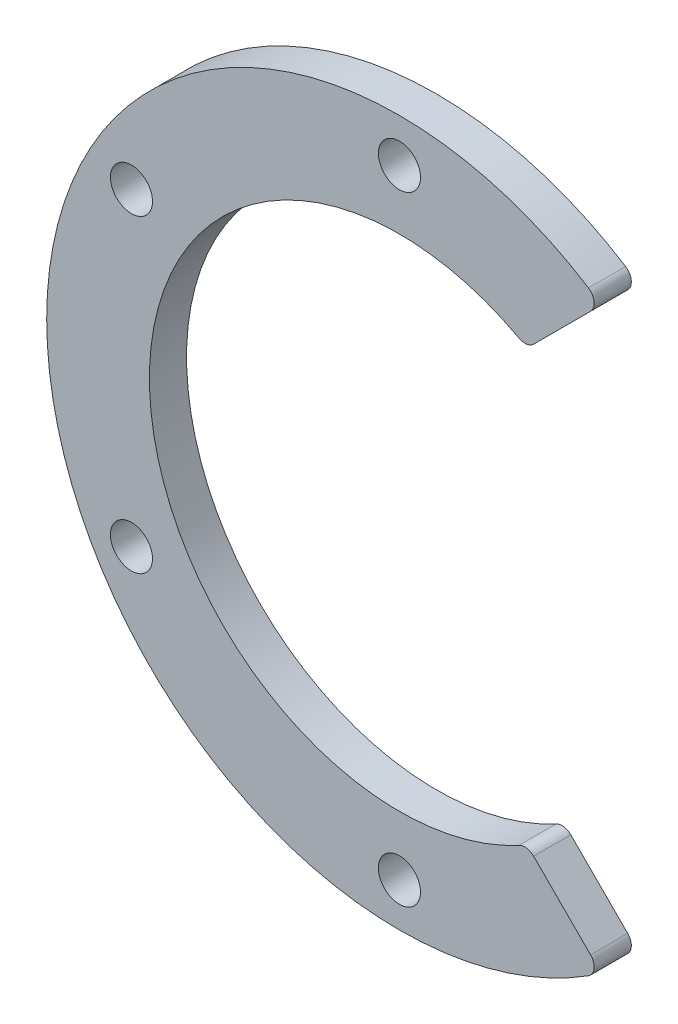
ISO-10303-21;
HEADER;
FILE_DESCRIPTION(('STEP AP214'),'2;1');
FILE_NAME('part.step','',(''),(''),'','','');
FILE_SCHEMA(('AUTOMOTIVE_DESIGN { 1 0 10303 214 1 1 1 1 }'));
ENDSEC;
DATA;
#1=APPLICATION_CONTEXT('core data for automotive mechanical design processes');
#2=APPLICATION_PROTOCOL_DEFINITION('international standard','automotive_design',2000,#1);
#3=PRODUCT_CONTEXT('',#1,'mechanical');
#4=PRODUCT('Part','Part','',(#3));
#5=PRODUCT_RELATED_PRODUCT_CATEGORY('part','',(#4));
#6=PRODUCT_DEFINITION_FORMATION('','',#4);
#7=PRODUCT_DEFINITION_CONTEXT('part definition',#1,'design');
#8=PRODUCT_DEFINITION('design','',#6,#7);
#9=PRODUCT_DEFINITION_SHAPE('','',#8);
#10=(LENGTH_UNIT() NAMED_UNIT(*) SI_UNIT(.MILLI.,.METRE.));
#11=(NAMED_UNIT(*) PLANE_ANGLE_UNIT() SI_UNIT($,.RADIAN.));
#12=(NAMED_UNIT(*) SI_UNIT($,.STERADIAN.) SOLID_ANGLE_UNIT());
#13=UNCERTAINTY_MEASURE_WITH_UNIT(LENGTH_MEASURE(1.E-05),#10,'distance_accuracy_value','');
#14=(GEOMETRIC_REPRESENTATION_CONTEXT(3) GLOBAL_UNCERTAINTY_ASSIGNED_CONTEXT((#13)) GLOBAL_UNIT_ASSIGNED_CONTEXT((#10,
#11,#12)) REPRESENTATION_CONTEXT('',''));
#15=CARTESIAN_POINT('',(0.,0.,0.));
#16=DIRECTION('',(0.,0.,1.));
#17=DIRECTION('',(1.,0.,0.));
#18=AXIS2_PLACEMENT_3D('',#15,#16,#17);
#19=CARTESIAN_POINT('',(14.734319027229,-23.2196004014676,3.));
#20=DIRECTION('',(0.,0.,-1.));
#21=DIRECTION('',(-1.,0.,0.));
#22=AXIS2_PLACEMENT_3D('',#19,#20,#21);
#23=CYLINDRICAL_SURFACE('',#22,1.00000000000001);
#24=CARTESIAN_POINT('',(14.734319027229,-23.2196004014676,0.));
#25=DIRECTION('',(0.,0.,-1.));
#26=DIRECTION('',(-1.,0.,0.));
#27=AXIS2_PLACEMENT_3D('',#24,#25,#26);
#28=CIRCLE('',#27,1.00000000000001);
#29=CARTESIAN_POINT('',(15.4414258084155,-22.5124936202811,0.));
#30=VERTEX_POINT('',#29);
#31=CARTESIAN_POINT('',(15.270112446401,-24.0639495069756,0.));
#32=VERTEX_POINT('',#31);
#33=EDGE_CURVE('E149',#30,#32,#28,.T.);
#34=ORIENTED_EDGE('',*,*,#33,.F.);
#35=DIRECTION('',(0.,0.,-1.));
#36=VECTOR('',#35,1.);
#37=CARTESIAN_POINT('',(15.4414258084155,-22.5124936202811,3.));
#38=LINE('',#37,#36);
#39=CARTESIAN_POINT('',(15.4414258084155,-22.5124936202811,3.));
#40=VERTEX_POINT('',#39);
#41=EDGE_CURVE('E11',#40,#30,#38,.T.);
#42=ORIENTED_EDGE('',*,*,#41,.F.);
#43=CARTESIAN_POINT('',(14.734319027229,-23.2196004014676,3.));
#44=DIRECTION('',(0.,0.,-1.));
#45=DIRECTION('',(-1.,0.,0.));
#46=AXIS2_PLACEMENT_3D('',#43,#44,#45);
#47=CIRCLE('',#46,1.00000000000001);
#48=CARTESIAN_POINT('',(15.270112446401,-24.0639495069756,3.));
#49=VERTEX_POINT('',#48);
#50=EDGE_CURVE('E178',#40,#49,#47,.T.);
#51=ORIENTED_EDGE('',*,*,#50,.T.);
#52=DIRECTION('',(0.,0.,-1.));
#53=VECTOR('',#52,1.);
#54=CARTESIAN_POINT('',(15.270112446401,-24.0639495069756,3.));
#55=LINE('',#54,#53);
#56=EDGE_CURVE('E48',#49,#32,#55,.T.);
#57=ORIENTED_EDGE('',*,*,#56,.T.);
#58=EDGE_LOOP('',(#34,#42,#51,#57));
#59=FACE_BOUND('',#58,.T.);
#60=ADVANCED_FACE('F45',(#59),#23,.T.);
#61=CARTESIAN_POINT('',(10.8422266985567,-17.9132945104223,3.));
#62=DIRECTION('',(0.707106781186549,0.707106781186546,0.));
#63=DIRECTION('',(-0.707106781186546,0.707106781186549,0.));
#64=AXIS2_PLACEMENT_3D('',#61,#62,#63);
#65=PLANE('',#64);
#66=DIRECTION('',(0.707106781186546,-0.707106781186549,0.));
#67=VECTOR('',#66,1.);
#68=CARTESIAN_POINT('',(10.8422266985567,-17.9132945104223,0.));
#69=LINE('',#68,#67);
#70=CARTESIAN_POINT('',(10.8422266985567,-17.9132945104222,0.));
#71=VERTEX_POINT('',#70);
#72=EDGE_CURVE('E175',#71,#30,#69,.T.);
#73=ORIENTED_EDGE('',*,*,#72,.F.);
#74=DIRECTION('',(0.,0.,-1.));
#75=VECTOR('',#74,1.);
#76=CARTESIAN_POINT('',(10.8422266985567,-17.9132945104222,3.));
#77=LINE('',#76,#75);
#78=CARTESIAN_POINT('',(10.8422266985567,-17.9132945104222,3.));
#79=VERTEX_POINT('',#78);
#80=EDGE_CURVE('E55',#79,#71,#77,.T.);
#81=ORIENTED_EDGE('',*,*,#80,.F.);
#82=DIRECTION('',(0.707106781186546,-0.707106781186549,0.));
#83=VECTOR('',#82,1.);
#84=CARTESIAN_POINT('',(10.8422266985567,-17.9132945104223,3.));
#85=LINE('',#84,#83);
#86=EDGE_CURVE('E134',#79,#40,#85,.T.);
#87=ORIENTED_EDGE('',*,*,#86,.T.);
#88=ORIENTED_EDGE('',*,*,#41,.T.);
#89=EDGE_LOOP('',(#73,#81,#87,#88));
#90=FACE_BOUND('',#89,.T.);
#91=ADVANCED_FACE('F196',(#90),#65,.T.);
#92=CARTESIAN_POINT('',(10.1351199173702,-18.6204012916088,3.));
#93=DIRECTION('',(0.,0.,-1.));
#94=DIRECTION('',(-1.,0.,0.));
#95=AXIS2_PLACEMENT_3D('',#92,#93,#94);
#96=CYLINDRICAL_SURFACE('',#95,0.999999999999997);
#97=CARTESIAN_POINT('',(10.1351199173702,-18.6204012916088,0.));
#98=DIRECTION('',(0.,0.,-1.));
#99=DIRECTION('',(-1.,0.,0.));
#100=AXIS2_PLACEMENT_3D('',#97,#98,#99);
#101=CIRCLE('',#100,0.999999999999997);
#102=CARTESIAN_POINT('',(9.65704822315463,-17.7420804759669,0.));
#103=VERTEX_POINT('',#102);
#104=EDGE_CURVE('E120',#103,#71,#101,.T.);
#105=ORIENTED_EDGE('',*,*,#104,.F.);
#106=DIRECTION('',(0.,0.,-1.));
#107=VECTOR('',#106,1.);
#108=CARTESIAN_POINT('',(9.65704822315463,-17.7420804759669,3.));
#109=LINE('',#108,#107);
#110=CARTESIAN_POINT('',(9.65704822315463,-17.7420804759669,3.));
#111=VERTEX_POINT('',#110);
#112=EDGE_CURVE('E115',#111,#103,#109,.T.);
#113=ORIENTED_EDGE('',*,*,#112,.F.);
#114=CARTESIAN_POINT('',(10.1351199173702,-18.6204012916088,3.));
#115=DIRECTION('',(0.,0.,-1.));
#116=DIRECTION('',(-1.,0.,0.));
#117=AXIS2_PLACEMENT_3D('',#114,#115,#116);
#118=CIRCLE('',#117,0.999999999999997);
#119=EDGE_CURVE('E118',#111,#79,#118,.T.);
#120=ORIENTED_EDGE('',*,*,#119,.T.);
#121=ORIENTED_EDGE('',*,*,#80,.T.);
#122=EDGE_LOOP('',(#105,#113,#120,#121));
#123=FACE_BOUND('',#122,.T.);
#124=ADVANCED_FACE('F117',(#123),#96,.T.);
#125=CARTESIAN_POINT('',(0.,0.,3.));
#126=DIRECTION('',(0.,0.,-1.));
#127=DIRECTION('',(-1.,0.,0.));
#128=AXIS2_PLACEMENT_3D('',#125,#126,#127);
#129=CYLINDRICAL_SURFACE('',#128,20.2000000000005);
#130=CARTESIAN_POINT('',(0.,0.,0.));
#131=DIRECTION('',(0.,0.,1.));
#132=DIRECTION('',(1.,0.,0.));
#133=AXIS2_PLACEMENT_3D('',#130,#131,#132);
#134=CIRCLE('',#133,20.2000000000005);
#135=CARTESIAN_POINT('',(9.65704822315463,17.7420804759669,0.));
#136=VERTEX_POINT('',#135);
#137=EDGE_CURVE('E170',#136,#103,#134,.T.);
#138=ORIENTED_EDGE('',*,*,#137,.F.);
#139=DIRECTION('',(0.,0.,-1.));
#140=VECTOR('',#139,1.);
#141=CARTESIAN_POINT('',(9.65704822315463,17.7420804759669,3.));
#142=LINE('',#141,#140);
#143=CARTESIAN_POINT('',(9.65704822315463,17.7420804759669,3.));
#144=VERTEX_POINT('',#143);
#145=EDGE_CURVE('E126',#144,#136,#142,.T.);
#146=ORIENTED_EDGE('',*,*,#145,.F.);
#147=CARTESIAN_POINT('',(0.,0.,3.));
#148=DIRECTION('',(0.,0.,1.));
#149=DIRECTION('',(1.,0.,0.));
#150=AXIS2_PLACEMENT_3D('',#147,#148,#149);
#151=CIRCLE('',#150,20.2000000000005);
#152=EDGE_CURVE('E132',#144,#111,#151,.T.);
#153=ORIENTED_EDGE('',*,*,#152,.T.);
#154=ORIENTED_EDGE('',*,*,#112,.T.);
#155=EDGE_LOOP('',(#138,#146,#153,#154));
#156=FACE_BOUND('',#155,.T.);
#157=ADVANCED_FACE('F137',(#156),#129,.F.);
#158=CARTESIAN_POINT('',(10.1351199173702,18.6204012916088,3.));
#159=DIRECTION('',(0.,0.,-1.));
#160=DIRECTION('',(-1.,0.,0.));
#161=AXIS2_PLACEMENT_3D('',#158,#159,#160);
#162=CYLINDRICAL_SURFACE('',#161,0.999999999999991);
#163=CARTESIAN_POINT('',(10.1351199173702,18.6204012916088,0.));
#164=DIRECTION('',(0.,0.,-1.));
#165=DIRECTION('',(-1.,0.,0.));
#166=AXIS2_PLACEMENT_3D('',#163,#164,#165);
#167=CIRCLE('',#166,0.999999999999991);
#168=CARTESIAN_POINT('',(10.8422266985567,17.9132945104223,0.));
#169=VERTEX_POINT('',#168);
#170=EDGE_CURVE('E166',#169,#136,#167,.T.);
#171=ORIENTED_EDGE('',*,*,#170,.F.);
#172=DIRECTION('',(0.,0.,-1.));
#173=VECTOR('',#172,1.);
#174=CARTESIAN_POINT('',(10.8422266985567,17.9132945104223,3.));
#175=LINE('',#174,#173);
#176=CARTESIAN_POINT('',(10.8422266985567,17.9132945104223,3.));
#177=VERTEX_POINT('',#176);
#178=EDGE_CURVE('E184',#177,#169,#175,.T.);
#179=ORIENTED_EDGE('',*,*,#178,.F.);
#180=CARTESIAN_POINT('',(10.1351199173702,18.6204012916088,3.));
#181=DIRECTION('',(0.,0.,-1.));
#182=DIRECTION('',(-1.,0.,0.));
#183=AXIS2_PLACEMENT_3D('',#180,#181,#182);
#184=CIRCLE('',#183,0.999999999999991);
#185=EDGE_CURVE('E139',#177,#144,#184,.T.);
#186=ORIENTED_EDGE('',*,*,#185,.T.);
#187=ORIENTED_EDGE('',*,*,#145,.T.);
#188=EDGE_LOOP('',(#171,#179,#186,#187));
#189=FACE_BOUND('',#188,.T.);
#190=ADVANCED_FACE('F208',(#189),#162,.T.);
#191=CARTESIAN_POINT('',(15.4414258084156,22.5124936202811,3.));
#192=DIRECTION('',(0.707106781186549,-0.707106781186546,0.));
#193=DIRECTION('',(0.707106781186546,0.707106781186549,0.));
#194=AXIS2_PLACEMENT_3D('',#191,#192,#193);
#195=PLANE('',#194);
#196=DIRECTION('',(-0.707106781186546,-0.707106781186549,0.));
#197=VECTOR('',#196,1.);
#198=CARTESIAN_POINT('',(15.4414258084156,22.5124936202811,0.));
#199=LINE('',#198,#197);
#200=CARTESIAN_POINT('',(15.4414258084156,22.5124936202811,0.));
#201=VERTEX_POINT('',#200);
#202=EDGE_CURVE('E162',#201,#169,#199,.T.);
#203=ORIENTED_EDGE('',*,*,#202,.F.);
#204=DIRECTION('',(0.,0.,-1.));
#205=VECTOR('',#204,1.);
#206=CARTESIAN_POINT('',(15.4414258084156,22.5124936202811,3.));
#207=LINE('',#206,#205);
#208=CARTESIAN_POINT('',(15.4414258084156,22.5124936202811,3.));
#209=VERTEX_POINT('',#208);
#210=EDGE_CURVE('E187',#209,#201,#207,.T.);
#211=ORIENTED_EDGE('',*,*,#210,.F.);
#212=DIRECTION('',(-0.707106781186546,-0.707106781186549,0.));
#213=VECTOR('',#212,1.);
#214=CARTESIAN_POINT('',(15.4414258084156,22.5124936202811,3.));
#215=LINE('',#214,#213);
#216=EDGE_CURVE('E143',#209,#177,#215,.T.);
#217=ORIENTED_EDGE('',*,*,#216,.T.);
#218=ORIENTED_EDGE('',*,*,#178,.T.);
#219=EDGE_LOOP('',(#203,#211,#217,#218));
#220=FACE_BOUND('',#219,.T.);
#221=ADVANCED_FACE('F211',(#220),#195,.T.);
#222=CARTESIAN_POINT('',(14.734319027229,23.2196004014676,3.));
#223=DIRECTION('',(0.,0.,-1.));
#224=DIRECTION('',(-1.,0.,0.));
#225=AXIS2_PLACEMENT_3D('',#222,#223,#224);
#226=CYLINDRICAL_SURFACE('',#225,1.);
#227=CARTESIAN_POINT('',(14.734319027229,23.2196004014676,0.));
#228=DIRECTION('',(0.,0.,-1.));
#229=DIRECTION('',(-1.,0.,0.));
#230=AXIS2_PLACEMENT_3D('',#227,#228,#229);
#231=CIRCLE('',#230,1.);
#232=CARTESIAN_POINT('',(15.270112446401,24.0639495069756,0.));
#233=VERTEX_POINT('',#232);
#234=EDGE_CURVE('E158',#233,#201,#231,.T.);
#235=ORIENTED_EDGE('',*,*,#234,.F.);
#236=DIRECTION('',(0.,0.,-1.));
#237=VECTOR('',#236,1.);
#238=CARTESIAN_POINT('',(15.270112446401,24.0639495069756,3.));
#239=LINE('',#238,#237);
#240=CARTESIAN_POINT('',(15.270112446401,24.0639495069756,3.));
#241=VERTEX_POINT('',#240);
#242=EDGE_CURVE('E188',#241,#233,#239,.T.);
#243=ORIENTED_EDGE('',*,*,#242,.F.);
#244=CARTESIAN_POINT('',(14.734319027229,23.2196004014676,3.));
#245=DIRECTION('',(0.,0.,-1.));
#246=DIRECTION('',(-1.,0.,0.));
#247=AXIS2_PLACEMENT_3D('',#244,#245,#246);
#248=CIRCLE('',#247,1.);
#249=EDGE_CURVE('E283',#241,#209,#248,.T.);
#250=ORIENTED_EDGE('',*,*,#249,.T.);
#251=ORIENTED_EDGE('',*,*,#210,.T.);
#252=EDGE_LOOP('',(#235,#243,#250,#251));
#253=FACE_BOUND('',#252,.T.);
#254=ADVANCED_FACE('F215',(#253),#226,.T.);
#255=CARTESIAN_POINT('',(0.,0.,3.));
#256=DIRECTION('',(0.,0.,-1.));
#257=DIRECTION('',(-1.,0.,0.));
#258=AXIS2_PLACEMENT_3D('',#255,#256,#257);
#259=CYLINDRICAL_SURFACE('',#258,28.5);
#260=CARTESIAN_POINT('',(0.,0.,0.));
#261=DIRECTION('',(0.,0.,-1.));
#262=DIRECTION('',(-1.,0.,0.));
#263=AXIS2_PLACEMENT_3D('',#260,#261,#262);
#264=CIRCLE('',#263,28.5);
#265=EDGE_CURVE('E153',#32,#233,#264,.T.);
#266=ORIENTED_EDGE('',*,*,#265,.F.);
#267=ORIENTED_EDGE('',*,*,#56,.F.);
#268=CARTESIAN_POINT('',(0.,0.,3.));
#269=DIRECTION('',(0.,0.,-1.));
#270=DIRECTION('',(-1.,0.,0.));
#271=AXIS2_PLACEMENT_3D('',#268,#269,#270);
#272=CIRCLE('',#271,28.5);
#273=EDGE_CURVE('E280',#49,#241,#272,.T.);
#274=ORIENTED_EDGE('',*,*,#273,.T.);
#275=ORIENTED_EDGE('',*,*,#242,.T.);
#276=EDGE_LOOP('',(#266,#267,#274,#275));
#277=FACE_BOUND('',#276,.T.);
#278=ADVANCED_FACE('F193',(#277),#259,.T.);
#279=CARTESIAN_POINT('',(14.734319027229,-23.2196004014676,3.));
#280=DIRECTION('',(0.,0.,-1.));
#281=DIRECTION('',(-1.,0.,0.));
#282=AXIS2_PLACEMENT_3D('',#279,#280,#281);
#283=PLANE('',#282);
#284=CARTESIAN_POINT('',(-21.6506350946109,-12.5,3.));
#285=DIRECTION('',(0.,0.,-1.));
#286=DIRECTION('',(1.,0.,0.));
#287=AXIS2_PLACEMENT_3D('',#284,#285,#286);
#288=CIRCLE('',#287,1.7);
#289=CARTESIAN_POINT('',(-19.9506350946109,-12.5,3.));
#290=VERTEX_POINT('',#289);
#291=EDGE_CURVE('E247',#290,#290,#288,.T.);
#292=ORIENTED_EDGE('',*,*,#291,.T.);
#293=EDGE_LOOP('',(#292));
#294=FACE_BOUND('',#293,.T.);
#295=CARTESIAN_POINT('',(-21.650635094611,12.5,3.));
#296=DIRECTION('',(0.,0.,-1.));
#297=DIRECTION('',(1.,0.,0.));
#298=AXIS2_PLACEMENT_3D('',#295,#296,#297);
#299=CIRCLE('',#298,1.7);
#300=CARTESIAN_POINT('',(-19.950635094611,12.5,3.));
#301=VERTEX_POINT('',#300);
#302=EDGE_CURVE('E257',#301,#301,#299,.T.);
#303=ORIENTED_EDGE('',*,*,#302,.T.);
#304=EDGE_LOOP('',(#303));
#305=FACE_BOUND('',#304,.T.);
#306=CARTESIAN_POINT('',(1.6614739120108E-13,-25.,3.));
#307=DIRECTION('',(0.,0.,-1.));
#308=DIRECTION('',(1.,0.,0.));
#309=AXIS2_PLACEMENT_3D('',#306,#307,#308);
#310=CIRCLE('',#309,1.7);
#311=CARTESIAN_POINT('',(1.70000000000017,-25.,3.));
#312=VERTEX_POINT('',#311);
#313=EDGE_CURVE('E265',#312,#312,#310,.T.);
#314=ORIENTED_EDGE('',*,*,#313,.T.);
#315=EDGE_LOOP('',(#314));
#316=FACE_BOUND('',#315,.T.);
#317=CARTESIAN_POINT('',(-1.6614739120108E-13,25.,3.));
#318=DIRECTION('',(0.,0.,-1.));
#319=DIRECTION('',(1.,0.,0.));
#320=AXIS2_PLACEMENT_3D('',#317,#318,#319);
#321=CIRCLE('',#320,1.7);
#322=CARTESIAN_POINT('',(1.69999999999983,25.,3.));
#323=VERTEX_POINT('',#322);
#324=EDGE_CURVE('E154',#323,#323,#321,.T.);
#325=ORIENTED_EDGE('',*,*,#324,.T.);
#326=EDGE_LOOP('',(#325));
#327=FACE_BOUND('',#326,.T.);
#328=ORIENTED_EDGE('',*,*,#50,.F.);
#329=ORIENTED_EDGE('',*,*,#86,.F.);
#330=ORIENTED_EDGE('',*,*,#119,.F.);
#331=ORIENTED_EDGE('',*,*,#152,.F.);
#332=ORIENTED_EDGE('',*,*,#185,.F.);
#333=ORIENTED_EDGE('',*,*,#216,.F.);
#334=ORIENTED_EDGE('',*,*,#249,.F.);
#335=ORIENTED_EDGE('',*,*,#273,.F.);
#336=EDGE_LOOP('',(#328,#329,#330,#331,#332,#333,#334,#335));
#337=FACE_BOUND('',#336,.T.);
#338=ADVANCED_FACE('F130',(#294,#305,#316,#327,#337),#283,.F.);
#339=CARTESIAN_POINT('',(14.734319027229,-23.2196004014676,0.));
#340=DIRECTION('',(0.,0.,-1.));
#341=DIRECTION('',(-1.,0.,0.));
#342=AXIS2_PLACEMENT_3D('',#339,#340,#341);
#343=PLANE('',#342);
#344=CARTESIAN_POINT('',(-21.6506350946109,-12.5,0.));
#345=DIRECTION('',(0.,0.,-1.));
#346=DIRECTION('',(1.,0.,0.));
#347=AXIS2_PLACEMENT_3D('',#344,#345,#346);
#348=CIRCLE('',#347,1.7);
#349=CARTESIAN_POINT('',(-19.9506350946109,-12.5,0.));
#350=VERTEX_POINT('',#349);
#351=EDGE_CURVE('E250',#350,#350,#348,.T.);
#352=ORIENTED_EDGE('',*,*,#351,.F.);
#353=EDGE_LOOP('',(#352));
#354=FACE_BOUND('',#353,.T.);
#355=CARTESIAN_POINT('',(-21.650635094611,12.5,0.));
#356=DIRECTION('',(0.,0.,-1.));
#357=DIRECTION('',(1.,0.,0.));
#358=AXIS2_PLACEMENT_3D('',#355,#356,#357);
#359=CIRCLE('',#358,1.7);
#360=CARTESIAN_POINT('',(-19.950635094611,12.5,0.));
#361=VERTEX_POINT('',#360);
#362=EDGE_CURVE('E254',#361,#361,#359,.T.);
#363=ORIENTED_EDGE('',*,*,#362,.F.);
#364=EDGE_LOOP('',(#363));
#365=FACE_BOUND('',#364,.T.);
#366=CARTESIAN_POINT('',(1.6614739120108E-13,-25.,0.));
#367=DIRECTION('',(0.,0.,-1.));
#368=DIRECTION('',(1.,0.,0.));
#369=AXIS2_PLACEMENT_3D('',#366,#367,#368);
#370=CIRCLE('',#369,1.7);
#371=CARTESIAN_POINT('',(1.70000000000017,-25.,0.));
#372=VERTEX_POINT('',#371);
#373=EDGE_CURVE('E261',#372,#372,#370,.T.);
#374=ORIENTED_EDGE('',*,*,#373,.F.);
#375=EDGE_LOOP('',(#374));
#376=FACE_BOUND('',#375,.T.);
#377=CARTESIAN_POINT('',(-1.6614739120108E-13,25.,0.));
#378=DIRECTION('',(0.,0.,-1.));
#379=DIRECTION('',(1.,0.,0.));
#380=AXIS2_PLACEMENT_3D('',#377,#378,#379);
#381=CIRCLE('',#380,1.7);
#382=CARTESIAN_POINT('',(1.69999999999983,25.,0.));
#383=VERTEX_POINT('',#382);
#384=EDGE_CURVE('E269',#383,#383,#381,.T.);
#385=ORIENTED_EDGE('',*,*,#384,.F.);
#386=EDGE_LOOP('',(#385));
#387=FACE_BOUND('',#386,.T.);
#388=ORIENTED_EDGE('',*,*,#33,.T.);
#389=ORIENTED_EDGE('',*,*,#265,.T.);
#390=ORIENTED_EDGE('',*,*,#234,.T.);
#391=ORIENTED_EDGE('',*,*,#202,.T.);
#392=ORIENTED_EDGE('',*,*,#170,.T.);
#393=ORIENTED_EDGE('',*,*,#137,.T.);
#394=ORIENTED_EDGE('',*,*,#104,.T.);
#395=ORIENTED_EDGE('',*,*,#72,.T.);
#396=EDGE_LOOP('',(#388,#389,#390,#391,#392,#393,#394,#395));
#397=FACE_BOUND('',#396,.T.);
#398=ADVANCED_FACE('F195',(#354,#365,#376,#387,#397),#343,.T.);
#399=CARTESIAN_POINT('',(-1.6614739120108E-13,25.,3.));
#400=DIRECTION('',(0.,0.,-1.));
#401=DIRECTION('',(-1.,0.,0.));
#402=AXIS2_PLACEMENT_3D('',#399,#400,#401);
#403=CYLINDRICAL_SURFACE('',#402,1.7);
#404=ORIENTED_EDGE('',*,*,#324,.F.);
#405=EDGE_LOOP('',(#404));
#406=FACE_BOUND('',#405,.T.);
#407=ORIENTED_EDGE('',*,*,#384,.T.);
#408=EDGE_LOOP('',(#407));
#409=FACE_BOUND('',#408,.T.);
#410=ADVANCED_FACE('F225',(#406,#409),#403,.F.);
#411=CARTESIAN_POINT('',(1.6614739120108E-13,-25.,3.));
#412=DIRECTION('',(0.,0.,-1.));
#413=DIRECTION('',(-1.,0.,0.));
#414=AXIS2_PLACEMENT_3D('',#411,#412,#413);
#415=CYLINDRICAL_SURFACE('',#414,1.7);
#416=ORIENTED_EDGE('',*,*,#313,.F.);
#417=EDGE_LOOP('',(#416));
#418=FACE_BOUND('',#417,.T.);
#419=ORIENTED_EDGE('',*,*,#373,.T.);
#420=EDGE_LOOP('',(#419));
#421=FACE_BOUND('',#420,.T.);
#422=ADVANCED_FACE('F232',(#418,#421),#415,.F.);
#423=CARTESIAN_POINT('',(-21.650635094611,12.5,3.));
#424=DIRECTION('',(0.,0.,-1.));
#425=DIRECTION('',(-1.,0.,0.));
#426=AXIS2_PLACEMENT_3D('',#423,#424,#425);
#427=CYLINDRICAL_SURFACE('',#426,1.7);
#428=ORIENTED_EDGE('',*,*,#302,.F.);
#429=EDGE_LOOP('',(#428));
#430=FACE_BOUND('',#429,.T.);
#431=ORIENTED_EDGE('',*,*,#362,.T.);
#432=EDGE_LOOP('',(#431));
#433=FACE_BOUND('',#432,.T.);
#434=ADVANCED_FACE('F236',(#430,#433),#427,.F.);
#435=CARTESIAN_POINT('',(-21.6506350946109,-12.5,3.));
#436=DIRECTION('',(0.,0.,-1.));
#437=DIRECTION('',(-1.,0.,0.));
#438=AXIS2_PLACEMENT_3D('',#435,#436,#437);
#439=CYLINDRICAL_SURFACE('',#438,1.7);
#440=ORIENTED_EDGE('',*,*,#291,.F.);
#441=EDGE_LOOP('',(#440));
#442=FACE_BOUND('',#441,.T.);
#443=ORIENTED_EDGE('',*,*,#351,.T.);
#444=EDGE_LOOP('',(#443));
#445=FACE_BOUND('',#444,.T.);
#446=ADVANCED_FACE('F240',(#442,#445),#439,.F.);
#447=CLOSED_SHELL('',(#60,#91,#124,#157,#190,#221,#254,#278,#338,#398,#410,#422,#434,#446));
#448=MANIFOLD_SOLID_BREP('B2',#447);
#449=ADVANCED_BREP_SHAPE_REPRESENTATION('',(#18,#448),#14);
#450=SHAPE_DEFINITION_REPRESENTATION(#9,#449);
ENDSEC;
END-ISO-10303-21;
